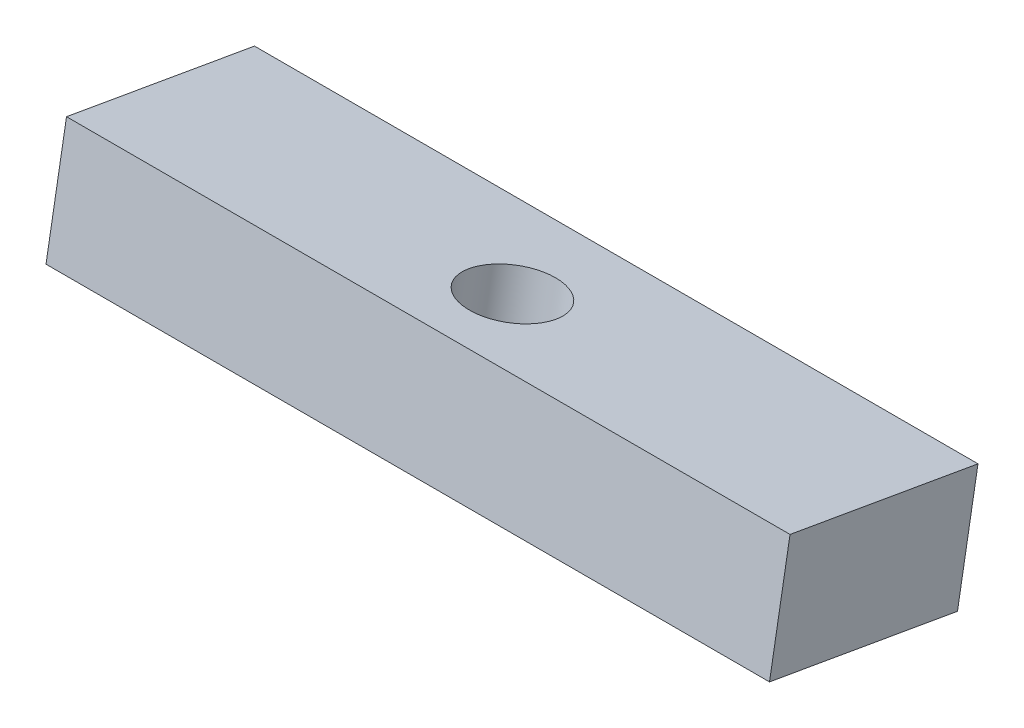
ISO-10303-21;
HEADER;
FILE_DESCRIPTION(('STEP AP214'),'2;1');
FILE_NAME('part.step','',(''),(''),'','','');
FILE_SCHEMA(('AUTOMOTIVE_DESIGN { 1 0 10303 214 1 1 1 1 }'));
ENDSEC;
DATA;
#1=APPLICATION_CONTEXT('core data for automotive mechanical design processes');
#2=APPLICATION_PROTOCOL_DEFINITION('international standard','automotive_design',2000,#1);
#3=PRODUCT_CONTEXT('',#1,'mechanical');
#4=PRODUCT('Part','Part','',(#3));
#5=PRODUCT_RELATED_PRODUCT_CATEGORY('part','',(#4));
#6=PRODUCT_DEFINITION_FORMATION('','',#4);
#7=PRODUCT_DEFINITION_CONTEXT('part definition',#1,'design');
#8=PRODUCT_DEFINITION('design','',#6,#7);
#9=PRODUCT_DEFINITION_SHAPE('','',#8);
#10=(LENGTH_UNIT() NAMED_UNIT(*) SI_UNIT(.MILLI.,.METRE.));
#11=(NAMED_UNIT(*) PLANE_ANGLE_UNIT() SI_UNIT($,.RADIAN.));
#12=(NAMED_UNIT(*) SI_UNIT($,.STERADIAN.) SOLID_ANGLE_UNIT());
#13=UNCERTAINTY_MEASURE_WITH_UNIT(LENGTH_MEASURE(1.E-05),#10,'distance_accuracy_value','');
#14=(GEOMETRIC_REPRESENTATION_CONTEXT(3) GLOBAL_UNCERTAINTY_ASSIGNED_CONTEXT((#13)) GLOBAL_UNIT_ASSIGNED_CONTEXT((#10,
#11,#12)) REPRESENTATION_CONTEXT('',''));
#15=CARTESIAN_POINT('',(0.,0.,0.));
#16=DIRECTION('',(0.,0.,1.));
#17=DIRECTION('',(1.,0.,0.));
#18=AXIS2_PLACEMENT_3D('',#15,#16,#17);
#19=CARTESIAN_POINT('',(0.,179.932425492263,-31.4160916817889));
#20=DIRECTION('',(0.,-0.985097402579215,0.171997405305091));
#21=DIRECTION('',(0.,-0.171997405305091,-0.985097402579215));
#22=AXIS2_PLACEMENT_3D('',#19,#20,#21);
#23=PLANE('',#22);
#24=DIRECTION('',(0.,-0.171997405305091,-0.985097402579215));
#25=VECTOR('',#24,1.);
#26=CARTESIAN_POINT('',(-15.65,168.56943278435,-96.4964606689595));
#27=LINE('',#26,#25);
#28=CARTESIAN_POINT('',(-15.65,168.56943278435,-96.4964606689595));
#29=VERTEX_POINT('',#28);
#30=CARTESIAN_POINT('',(-15.65,167.743845238886,-101.22492820134));
#31=VERTEX_POINT('',#30);
#32=EDGE_CURVE('E90',#29,#31,#27,.T.);
#33=ORIENTED_EDGE('',*,*,#32,.T.);
#34=DIRECTION('',(1.,0.,0.));
#35=VECTOR('',#34,1.);
#36=CARTESIAN_POINT('',(-15.65,167.743845238886,-101.22492820134));
#37=LINE('',#36,#35);
#38=CARTESIAN_POINT('',(2.55000000000001,167.743845238886,-101.22492820134));
#39=VERTEX_POINT('',#38);
#40=EDGE_CURVE('E84',#31,#39,#37,.T.);
#41=ORIENTED_EDGE('',*,*,#40,.T.);
#42=DIRECTION('',(0.,0.171997405305091,0.985097402579215));
#43=VECTOR('',#42,1.);
#44=CARTESIAN_POINT('',(2.55000000000001,168.56943278435,-96.4964606689595));
#45=LINE('',#44,#43);
#46=CARTESIAN_POINT('',(2.55000000000001,168.56943278435,-96.4964606689595));
#47=VERTEX_POINT('',#46);
#48=EDGE_CURVE('E87',#39,#47,#45,.T.);
#49=ORIENTED_EDGE('',*,*,#48,.T.);
#50=DIRECTION('',(-1.,0.,0.));
#51=VECTOR('',#50,1.);
#52=CARTESIAN_POINT('',(-5.99999999999997,168.56943278435,-96.4964606689595));
#53=LINE('',#52,#51);
#54=EDGE_CURVE('E56',#47,#29,#53,.T.);
#55=ORIENTED_EDGE('',*,*,#54,.T.);
#56=EDGE_LOOP('',(#33,#41,#49,#55));
#57=FACE_BOUND('',#56,.T.);
#58=CARTESIAN_POINT('',(-6.54999999999997,168.199638362944,-98.6144200845048));
#59=DIRECTION('',(0.,-0.985097402579216,0.171997405305088));
#60=DIRECTION('',(0.,-0.171997405305088,-0.985097402579216));
#61=AXIS2_PLACEMENT_3D('',#58,#59,#60);
#62=CIRCLE('',#61,1.10000000000002);
#63=CARTESIAN_POINT('',(-6.54999999999997,168.010441217108,-99.698027227342));
#64=VERTEX_POINT('',#63);
#65=EDGE_CURVE('E107',#64,#64,#62,.T.);
#66=ORIENTED_EDGE('',*,*,#65,.F.);
#67=EDGE_LOOP('',(#66));
#68=FACE_BOUND('',#67,.T.);
#69=ADVANCED_FACE('F39',(#57,#68),#23,.T.);
#70=CARTESIAN_POINT('',(0.,182.8877177,-31.9320838977042));
#71=DIRECTION('',(0.,-0.985097402579215,0.171997405305091));
#72=DIRECTION('',(0.,-0.171997405305091,-0.985097402579215));
#73=AXIS2_PLACEMENT_3D('',#70,#71,#72);
#74=PLANE('',#73);
#75=DIRECTION('',(0.,-0.171997405305091,-0.985097402579215));
#76=VECTOR('',#75,1.);
#77=CARTESIAN_POINT('',(-15.65,171.524724992088,-97.0124528848748));
#78=LINE('',#77,#76);
#79=CARTESIAN_POINT('',(-15.65,171.524724992088,-97.0124528848748));
#80=VERTEX_POINT('',#79);
#81=CARTESIAN_POINT('',(-15.65,170.699137446623,-101.740920417255));
#82=VERTEX_POINT('',#81);
#83=EDGE_CURVE('E104',#80,#82,#78,.T.);
#84=ORIENTED_EDGE('',*,*,#83,.F.);
#85=DIRECTION('',(-1.,0.,0.));
#86=VECTOR('',#85,1.);
#87=CARTESIAN_POINT('',(-15.65,171.524724992088,-97.0124528848748));
#88=LINE('',#87,#86);
#89=CARTESIAN_POINT('',(2.55000000000001,171.524724992088,-97.0124528848748));
#90=VERTEX_POINT('',#89);
#91=EDGE_CURVE('E73',#90,#80,#88,.T.);
#92=ORIENTED_EDGE('',*,*,#91,.F.);
#93=DIRECTION('',(0.,0.171997405305091,0.985097402579215));
#94=VECTOR('',#93,1.);
#95=CARTESIAN_POINT('',(2.55000000000001,171.524724992088,-97.0124528848748));
#96=LINE('',#95,#94);
#97=CARTESIAN_POINT('',(2.55000000000001,170.699137446623,-101.740920417255));
#98=VERTEX_POINT('',#97);
#99=EDGE_CURVE('E109',#98,#90,#96,.T.);
#100=ORIENTED_EDGE('',*,*,#99,.F.);
#101=DIRECTION('',(1.,0.,0.));
#102=VECTOR('',#101,1.);
#103=CARTESIAN_POINT('',(-15.65,170.699137446623,-101.740920417255));
#104=LINE('',#103,#102);
#105=EDGE_CURVE('E95',#82,#98,#104,.T.);
#106=ORIENTED_EDGE('',*,*,#105,.F.);
#107=EDGE_LOOP('',(#84,#92,#100,#106));
#108=FACE_BOUND('',#107,.T.);
#109=CARTESIAN_POINT('',(-6.54999999999997,171.154930570682,-99.1304123004201));
#110=DIRECTION('',(0.,-0.985097402579216,0.171997405305088));
#111=DIRECTION('',(0.,-0.171997405305088,-0.985097402579216));
#112=AXIS2_PLACEMENT_3D('',#109,#110,#111);
#113=CIRCLE('',#112,1.10000000000002);
#114=CARTESIAN_POINT('',(-6.54999999999997,170.965733424846,-100.214019443257));
#115=VERTEX_POINT('',#114);
#116=EDGE_CURVE('E116',#115,#115,#113,.T.);
#117=ORIENTED_EDGE('',*,*,#116,.T.);
#118=EDGE_LOOP('',(#117));
#119=FACE_BOUND('',#118,.T.);
#120=ADVANCED_FACE('F125',(#108,#119),#74,.F.);
#121=CARTESIAN_POINT('',(-15.65,168.56943278435,-96.4964606689595));
#122=DIRECTION('',(1.,0.,0.));
#123=DIRECTION('',(0.,1.,0.));
#124=AXIS2_PLACEMENT_3D('',#121,#122,#123);
#125=PLANE('',#124);
#126=ORIENTED_EDGE('',*,*,#83,.T.);
#127=DIRECTION('',(0.,0.985097402579216,-0.171997405305088));
#128=VECTOR('',#127,1.);
#129=CARTESIAN_POINT('',(-15.65,167.743845238886,-101.22492820134));
#130=LINE('',#129,#128);
#131=EDGE_CURVE('E11',#31,#82,#130,.T.);
#132=ORIENTED_EDGE('',*,*,#131,.F.);
#133=ORIENTED_EDGE('',*,*,#32,.F.);
#134=DIRECTION('',(0.,0.985097402579216,-0.171997405305088));
#135=VECTOR('',#134,1.);
#136=CARTESIAN_POINT('',(-15.65,168.56943278435,-96.4964606689595));
#137=LINE('',#136,#135);
#138=EDGE_CURVE('E100',#29,#80,#137,.T.);
#139=ORIENTED_EDGE('',*,*,#138,.T.);
#140=EDGE_LOOP('',(#126,#132,#133,#139));
#141=FACE_BOUND('',#140,.T.);
#142=ADVANCED_FACE('F41',(#141),#125,.F.);
#143=CARTESIAN_POINT('',(-15.65,167.743845238886,-101.22492820134));
#144=DIRECTION('',(0.,0.171997405305088,0.985097402579216));
#145=DIRECTION('',(0.,-0.985097402579216,0.171997405305088));
#146=AXIS2_PLACEMENT_3D('',#143,#144,#145);
#147=PLANE('',#146);
#148=ORIENTED_EDGE('',*,*,#105,.T.);
#149=DIRECTION('',(0.,0.985097402579216,-0.171997405305088));
#150=VECTOR('',#149,1.);
#151=CARTESIAN_POINT('',(2.55000000000001,167.743845238886,-101.22492820134));
#152=LINE('',#151,#150);
#153=EDGE_CURVE('E48',#39,#98,#152,.T.);
#154=ORIENTED_EDGE('',*,*,#153,.F.);
#155=ORIENTED_EDGE('',*,*,#40,.F.);
#156=ORIENTED_EDGE('',*,*,#131,.T.);
#157=EDGE_LOOP('',(#148,#154,#155,#156));
#158=FACE_BOUND('',#157,.T.);
#159=ADVANCED_FACE('F94',(#158),#147,.F.);
#160=CARTESIAN_POINT('',(2.55000000000001,168.56943278435,-96.4964606689595));
#161=DIRECTION('',(-1.,0.,0.));
#162=DIRECTION('',(0.,-1.,0.));
#163=AXIS2_PLACEMENT_3D('',#160,#161,#162);
#164=PLANE('',#163);
#165=ORIENTED_EDGE('',*,*,#99,.T.);
#166=DIRECTION('',(0.,0.985097402579216,-0.171997405305088));
#167=VECTOR('',#166,1.);
#168=CARTESIAN_POINT('',(2.55000000000001,168.56943278435,-96.4964606689595));
#169=LINE('',#168,#167);
#170=EDGE_CURVE('E97',#47,#90,#169,.T.);
#171=ORIENTED_EDGE('',*,*,#170,.F.);
#172=ORIENTED_EDGE('',*,*,#48,.F.);
#173=ORIENTED_EDGE('',*,*,#153,.T.);
#174=EDGE_LOOP('',(#165,#171,#172,#173));
#175=FACE_BOUND('',#174,.T.);
#176=ADVANCED_FACE('F98',(#175),#164,.F.);
#177=CARTESIAN_POINT('',(-15.65,168.56943278435,-96.4964606689595));
#178=DIRECTION('',(0.,-0.171997405305088,-0.985097402579216));
#179=DIRECTION('',(0.,0.985097402579216,-0.171997405305088));
#180=AXIS2_PLACEMENT_3D('',#177,#178,#179);
#181=PLANE('',#180);
#182=ORIENTED_EDGE('',*,*,#91,.T.);
#183=ORIENTED_EDGE('',*,*,#138,.F.);
#184=ORIENTED_EDGE('',*,*,#54,.F.);
#185=ORIENTED_EDGE('',*,*,#170,.T.);
#186=EDGE_LOOP('',(#182,#183,#184,#185));
#187=FACE_BOUND('',#186,.T.);
#188=ADVANCED_FACE('F113',(#187),#181,.F.);
#189=CARTESIAN_POINT('',(-6.54999999999997,168.199638362944,-98.6144200845048));
#190=DIRECTION('',(0.,0.985097402579216,-0.171997405305088));
#191=DIRECTION('',(0.,0.171997405305088,0.985097402579216));
#192=AXIS2_PLACEMENT_3D('',#189,#190,#191);
#193=CYLINDRICAL_SURFACE('',#192,1.10000000000002);
#194=ORIENTED_EDGE('',*,*,#65,.T.);
#195=EDGE_LOOP('',(#194));
#196=FACE_BOUND('',#195,.T.);
#197=ORIENTED_EDGE('',*,*,#116,.F.);
#198=EDGE_LOOP('',(#197));
#199=FACE_BOUND('',#198,.T.);
#200=ADVANCED_FACE('F122',(#196,#199),#193,.F.);
#201=CLOSED_SHELL('',(#69,#120,#142,#159,#176,#188,#200));
#202=MANIFOLD_SOLID_BREP('B2',#201);
#203=ADVANCED_BREP_SHAPE_REPRESENTATION('',(#18,#202),#14);
#204=SHAPE_DEFINITION_REPRESENTATION(#9,#203);
ENDSEC;
END-ISO-10303-21;
